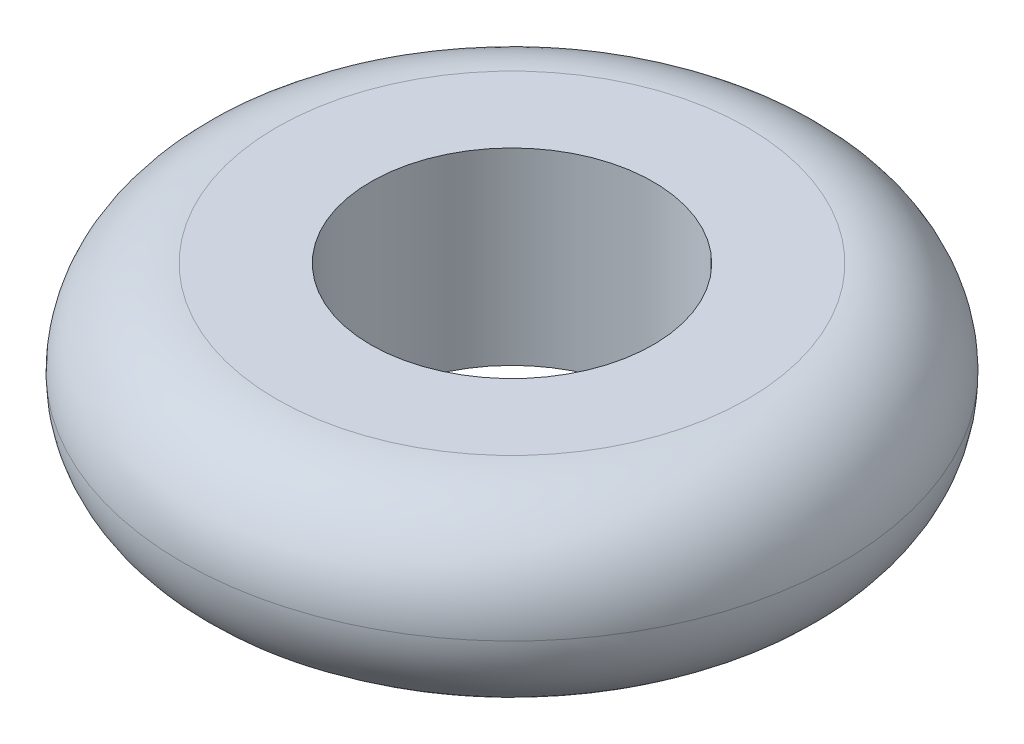
ISO-10303-21;
HEADER;
FILE_DESCRIPTION(('STEP AP214'),'2;1');
FILE_NAME('part.step','',(''),(''),'','','');
FILE_SCHEMA(('AUTOMOTIVE_DESIGN { 1 0 10303 214 1 1 1 1 }'));
ENDSEC;
DATA;
#1=APPLICATION_CONTEXT('core data for automotive mechanical design processes');
#2=APPLICATION_PROTOCOL_DEFINITION('international standard','automotive_design',2000,#1);
#3=PRODUCT_CONTEXT('',#1,'mechanical');
#4=PRODUCT('Part','Part','',(#3));
#5=PRODUCT_RELATED_PRODUCT_CATEGORY('part','',(#4));
#6=PRODUCT_DEFINITION_FORMATION('','',#4);
#7=PRODUCT_DEFINITION_CONTEXT('part definition',#1,'design');
#8=PRODUCT_DEFINITION('design','',#6,#7);
#9=PRODUCT_DEFINITION_SHAPE('','',#8);
#10=(LENGTH_UNIT() NAMED_UNIT(*) SI_UNIT(.MILLI.,.METRE.));
#11=(NAMED_UNIT(*) PLANE_ANGLE_UNIT() SI_UNIT($,.RADIAN.));
#12=(NAMED_UNIT(*) SI_UNIT($,.STERADIAN.) SOLID_ANGLE_UNIT());
#13=UNCERTAINTY_MEASURE_WITH_UNIT(LENGTH_MEASURE(1.E-05),#10,'distance_accuracy_value','');
#14=(GEOMETRIC_REPRESENTATION_CONTEXT(3) GLOBAL_UNCERTAINTY_ASSIGNED_CONTEXT((#13)) GLOBAL_UNIT_ASSIGNED_CONTEXT((#10,
#11,#12)) REPRESENTATION_CONTEXT('',''));
#15=CARTESIAN_POINT('',(0.,0.,0.));
#16=DIRECTION('',(0.,0.,1.));
#17=DIRECTION('',(1.,0.,0.));
#18=AXIS2_PLACEMENT_3D('',#15,#16,#17);
#19=CARTESIAN_POINT('',(0.,1.,-0.377014359847341));
#20=DIRECTION('',(0.,1.,0.));
#21=DIRECTION('',(0.,0.,1.));
#22=AXIS2_PLACEMENT_3D('',#19,#20,#21);
#23=PLANE('',#22);
#24=CARTESIAN_POINT('',(0.,1.,-0.377014359847341));
#25=DIRECTION('',(0.,1.,0.));
#26=DIRECTION('',(0.,0.,1.));
#27=AXIS2_PLACEMENT_3D('',#24,#25,#26);
#28=CIRCLE('',#27,1.25);
#29=CARTESIAN_POINT('',(0.,1.,0.872985640152657));
#30=VERTEX_POINT('',#29);
#31=EDGE_CURVE('E10',#30,#30,#28,.T.);
#32=ORIENTED_EDGE('',*,*,#31,.T.);
#33=EDGE_LOOP('',(#32));
#34=FACE_BOUND('',#33,.T.);
#35=CARTESIAN_POINT('',(0.,1.,-0.377014359847341));
#36=DIRECTION('',(0.,1.,0.));
#37=DIRECTION('',(0.,0.,1.));
#38=AXIS2_PLACEMENT_3D('',#35,#36,#37);
#39=CIRCLE('',#38,0.749999999999998);
#40=CARTESIAN_POINT('',(0.,1.,0.372985640152657));
#41=VERTEX_POINT('',#40);
#42=EDGE_CURVE('E42',#41,#41,#39,.T.);
#43=ORIENTED_EDGE('',*,*,#42,.F.);
#44=EDGE_LOOP('',(#43));
#45=FACE_BOUND('',#44,.T.);
#46=ADVANCED_FACE('F30',(#34,#45),#23,.T.);
#47=CARTESIAN_POINT('',(0.,0.,-0.377014359847341));
#48=DIRECTION('',(0.,1.,0.));
#49=DIRECTION('',(0.,0.,1.));
#50=AXIS2_PLACEMENT_3D('',#47,#48,#49);
#51=PLANE('',#50);
#52=CARTESIAN_POINT('',(0.,0.,-0.377014359847341));
#53=DIRECTION('',(0.,1.,0.));
#54=DIRECTION('',(0.,0.,1.));
#55=AXIS2_PLACEMENT_3D('',#52,#53,#54);
#56=CIRCLE('',#55,1.25);
#57=CARTESIAN_POINT('',(0.,0.,0.872985640152657));
#58=VERTEX_POINT('',#57);
#59=EDGE_CURVE('E38',#58,#58,#56,.F.);
#60=ORIENTED_EDGE('',*,*,#59,.T.);
#61=EDGE_LOOP('',(#60));
#62=FACE_BOUND('',#61,.T.);
#63=CARTESIAN_POINT('',(0.,0.,-0.377014359847341));
#64=DIRECTION('',(0.,1.,0.));
#65=DIRECTION('',(0.,0.,1.));
#66=AXIS2_PLACEMENT_3D('',#63,#64,#65);
#67=CIRCLE('',#66,0.749999999999998);
#68=CARTESIAN_POINT('',(0.,0.,0.372985640152657));
#69=VERTEX_POINT('',#68);
#70=EDGE_CURVE('E45',#69,#69,#67,.T.);
#71=ORIENTED_EDGE('',*,*,#70,.T.);
#72=EDGE_LOOP('',(#71));
#73=FACE_BOUND('',#72,.T.);
#74=ADVANCED_FACE('F55',(#62,#73),#51,.F.);
#75=CARTESIAN_POINT('',(0.,1.,-0.377014359847341));
#76=DIRECTION('',(0.,-1.,0.));
#77=DIRECTION('',(0.,0.,-1.));
#78=AXIS2_PLACEMENT_3D('',#75,#76,#77);
#79=CYLINDRICAL_SURFACE('',#78,0.749999999999998);
#80=ORIENTED_EDGE('',*,*,#42,.T.);
#81=EDGE_LOOP('',(#80));
#82=FACE_BOUND('',#81,.T.);
#83=ORIENTED_EDGE('',*,*,#70,.F.);
#84=EDGE_LOOP('',(#83));
#85=FACE_BOUND('',#84,.T.);
#86=ADVANCED_FACE('F51',(#82,#85),#79,.F.);
#87=CARTESIAN_POINT('',(0.,0.5,-0.377014359847341));
#88=DIRECTION('',(0.,1.,0.));
#89=DIRECTION('',(0.,0.,1.));
#90=AXIS2_PLACEMENT_3D('',#87,#88,#89);
#91=TOROIDAL_SURFACE('',#90,1.25,0.5);
#92=ORIENTED_EDGE('',*,*,#31,.F.);
#93=EDGE_LOOP('',(#92));
#94=FACE_BOUND('',#93,.T.);
#95=CARTESIAN_POINT('',(0.,0.5,-0.377014359847341));
#96=DIRECTION('',(0.,1.,0.));
#97=DIRECTION('',(0.,0.,1.));
#98=AXIS2_PLACEMENT_3D('',#95,#96,#97);
#99=CIRCLE('',#98,1.75);
#100=CARTESIAN_POINT('',(0.,0.5,1.37298564015266));
#101=VERTEX_POINT('',#100);
#102=EDGE_CURVE('E34',#101,#101,#99,.F.);
#103=ORIENTED_EDGE('',*,*,#102,.F.);
#104=EDGE_LOOP('',(#103));
#105=FACE_BOUND('',#104,.T.);
#106=ADVANCED_FACE('F32',(#94,#105),#91,.T.);
#107=CARTESIAN_POINT('',(0.,0.5,-0.377014359847341));
#108=DIRECTION('',(0.,1.,0.));
#109=DIRECTION('',(0.,0.,1.));
#110=AXIS2_PLACEMENT_3D('',#107,#108,#109);
#111=TOROIDAL_SURFACE('',#110,1.25,0.5);
#112=ORIENTED_EDGE('',*,*,#59,.F.);
#113=EDGE_LOOP('',(#112));
#114=FACE_BOUND('',#113,.T.);
#115=ORIENTED_EDGE('',*,*,#102,.T.);
#116=EDGE_LOOP('',(#115));
#117=FACE_BOUND('',#116,.T.);
#118=ADVANCED_FACE('F63',(#114,#117),#111,.T.);
#119=CLOSED_SHELL('',(#46,#74,#86,#106,#118));
#120=MANIFOLD_SOLID_BREP('B2',#119);
#121=ADVANCED_BREP_SHAPE_REPRESENTATION('',(#18,#120),#14);
#122=SHAPE_DEFINITION_REPRESENTATION(#9,#121);
ENDSEC;
END-ISO-10303-21;
